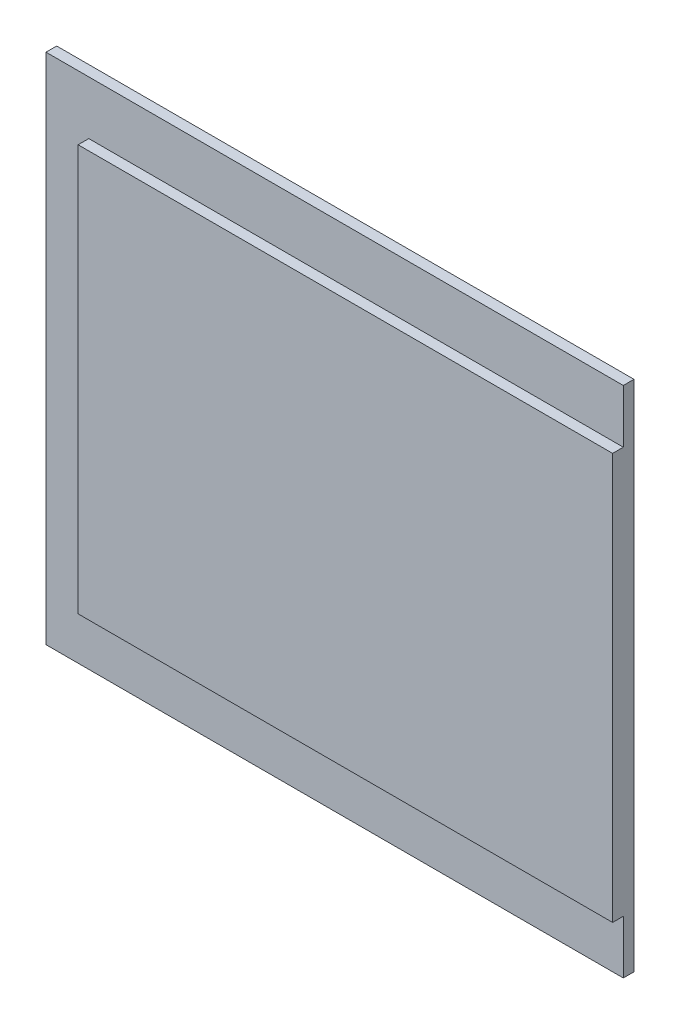
ISO-10303-21;
HEADER;
FILE_DESCRIPTION(('STEP AP214'),'2;1');
FILE_NAME('part.step','',(''),(''),'','','');
FILE_SCHEMA(('AUTOMOTIVE_DESIGN { 1 0 10303 214 1 1 1 1 }'));
ENDSEC;
DATA;
#1=APPLICATION_CONTEXT('core data for automotive mechanical design processes');
#2=APPLICATION_PROTOCOL_DEFINITION('international standard','automotive_design',2000,#1);
#3=PRODUCT_CONTEXT('',#1,'mechanical');
#4=PRODUCT('Part','Part','',(#3));
#5=PRODUCT_RELATED_PRODUCT_CATEGORY('part','',(#4));
#6=PRODUCT_DEFINITION_FORMATION('','',#4);
#7=PRODUCT_DEFINITION_CONTEXT('part definition',#1,'design');
#8=PRODUCT_DEFINITION('design','',#6,#7);
#9=PRODUCT_DEFINITION_SHAPE('','',#8);
#10=(LENGTH_UNIT() NAMED_UNIT(*) SI_UNIT(.MILLI.,.METRE.));
#11=(NAMED_UNIT(*) PLANE_ANGLE_UNIT() SI_UNIT($,.RADIAN.));
#12=(NAMED_UNIT(*) SI_UNIT($,.STERADIAN.) SOLID_ANGLE_UNIT());
#13=UNCERTAINTY_MEASURE_WITH_UNIT(LENGTH_MEASURE(1.E-05),#10,'distance_accuracy_value','');
#14=(GEOMETRIC_REPRESENTATION_CONTEXT(3) GLOBAL_UNCERTAINTY_ASSIGNED_CONTEXT((#13)) GLOBAL_UNIT_ASSIGNED_CONTEXT((#10,
#11,#12)) REPRESENTATION_CONTEXT('',''));
#15=CARTESIAN_POINT('',(0.,0.,0.));
#16=DIRECTION('',(0.,0.,1.));
#17=DIRECTION('',(1.,0.,0.));
#18=AXIS2_PLACEMENT_3D('',#15,#16,#17);
#19=CARTESIAN_POINT('',(0.,0.,1.));
#20=DIRECTION('',(0.,0.,-1.));
#21=DIRECTION('',(-1.,0.,0.));
#22=AXIS2_PLACEMENT_3D('',#19,#20,#21);
#23=PLANE('',#22);
#24=DIRECTION('',(1.,0.,0.));
#25=VECTOR('',#24,1.);
#26=CARTESIAN_POINT('',(-23.,-19.,1.));
#27=LINE('',#26,#25);
#28=CARTESIAN_POINT('',(-23.,-19.,1.));
#29=VERTEX_POINT('',#28);
#30=CARTESIAN_POINT('',(27.,-19.,1.));
#31=VERTEX_POINT('',#30);
#32=EDGE_CURVE('E50',#29,#31,#27,.T.);
#33=ORIENTED_EDGE('',*,*,#32,.F.);
#34=DIRECTION('',(0.,-1.,0.));
#35=VECTOR('',#34,1.);
#36=CARTESIAN_POINT('',(-23.,-19.,1.));
#37=LINE('',#36,#35);
#38=CARTESIAN_POINT('',(-23.,19.,1.));
#39=VERTEX_POINT('',#38);
#40=EDGE_CURVE('E171',#39,#29,#37,.T.);
#41=ORIENTED_EDGE('',*,*,#40,.F.);
#42=DIRECTION('',(-1.,0.,0.));
#43=VECTOR('',#42,1.);
#44=CARTESIAN_POINT('',(-23.,19.,1.));
#45=LINE('',#44,#43);
#46=CARTESIAN_POINT('',(27.,19.,1.));
#47=VERTEX_POINT('',#46);
#48=EDGE_CURVE('E56',#47,#39,#45,.T.);
#49=ORIENTED_EDGE('',*,*,#48,.F.);
#50=DIRECTION('',(0.,1.,0.));
#51=VECTOR('',#50,1.);
#52=CARTESIAN_POINT('',(27.,-24.,1.));
#53=LINE('',#52,#51);
#54=CARTESIAN_POINT('',(27.,24.,1.));
#55=VERTEX_POINT('',#54);
#56=EDGE_CURVE('E121',#47,#55,#53,.T.);
#57=ORIENTED_EDGE('',*,*,#56,.T.);
#58=DIRECTION('',(-1.,0.,0.));
#59=VECTOR('',#58,1.);
#60=CARTESIAN_POINT('',(-27.,24.,1.));
#61=LINE('',#60,#59);
#62=CARTESIAN_POINT('',(-27.,24.,1.));
#63=VERTEX_POINT('',#62);
#64=EDGE_CURVE('E132',#55,#63,#61,.T.);
#65=ORIENTED_EDGE('',*,*,#64,.T.);
#66=DIRECTION('',(0.,-1.,0.));
#67=VECTOR('',#66,1.);
#68=CARTESIAN_POINT('',(-27.,-24.,1.));
#69=LINE('',#68,#67);
#70=CARTESIAN_POINT('',(-27.,-24.,1.));
#71=VERTEX_POINT('',#70);
#72=EDGE_CURVE('E134',#63,#71,#69,.T.);
#73=ORIENTED_EDGE('',*,*,#72,.T.);
#74=DIRECTION('',(1.,0.,0.));
#75=VECTOR('',#74,1.);
#76=CARTESIAN_POINT('',(-27.,-24.,1.));
#77=LINE('',#76,#75);
#78=CARTESIAN_POINT('',(27.,-24.,1.));
#79=VERTEX_POINT('',#78);
#80=EDGE_CURVE('E136',#71,#79,#77,.T.);
#81=ORIENTED_EDGE('',*,*,#80,.T.);
#82=EDGE_CURVE('E130',#79,#31,#53,.T.);
#83=ORIENTED_EDGE('',*,*,#82,.T.);
#84=EDGE_LOOP('',(#33,#41,#49,#57,#65,#73,#81,#83));
#85=FACE_BOUND('',#84,.T.);
#86=ADVANCED_FACE('F35',(#85),#23,.F.);
#87=CARTESIAN_POINT('',(27.,-24.,1.));
#88=DIRECTION('',(-1.,0.,0.));
#89=DIRECTION('',(0.,0.,1.));
#90=AXIS2_PLACEMENT_3D('',#87,#88,#89);
#91=PLANE('',#90);
#92=DIRECTION('',(0.,1.,0.));
#93=VECTOR('',#92,1.);
#94=CARTESIAN_POINT('',(27.,-24.,0.));
#95=LINE('',#94,#93);
#96=CARTESIAN_POINT('',(27.,-24.,0.));
#97=VERTEX_POINT('',#96);
#98=CARTESIAN_POINT('',(27.,24.,0.));
#99=VERTEX_POINT('',#98);
#100=EDGE_CURVE('E122',#97,#99,#95,.T.);
#101=ORIENTED_EDGE('',*,*,#100,.T.);
#102=DIRECTION('',(0.,0.,-1.));
#103=VECTOR('',#102,1.);
#104=CARTESIAN_POINT('',(27.,24.,1.));
#105=LINE('',#104,#103);
#106=EDGE_CURVE('E11',#55,#99,#105,.T.);
#107=ORIENTED_EDGE('',*,*,#106,.F.);
#108=ORIENTED_EDGE('',*,*,#56,.F.);
#109=DIRECTION('',(0.,0.,-1.));
#110=VECTOR('',#109,1.);
#111=CARTESIAN_POINT('',(27.,19.,2.));
#112=LINE('',#111,#110);
#113=CARTESIAN_POINT('',(27.,19.,2.));
#114=VERTEX_POINT('',#113);
#115=EDGE_CURVE('E103',#114,#47,#112,.T.);
#116=ORIENTED_EDGE('',*,*,#115,.F.);
#117=DIRECTION('',(0.,1.,0.));
#118=VECTOR('',#117,1.);
#119=CARTESIAN_POINT('',(27.,-19.,2.));
#120=LINE('',#119,#118);
#121=CARTESIAN_POINT('',(27.,-19.,2.));
#122=VERTEX_POINT('',#121);
#123=EDGE_CURVE('E109',#122,#114,#120,.T.);
#124=ORIENTED_EDGE('',*,*,#123,.F.);
#125=DIRECTION('',(0.,0.,-1.));
#126=VECTOR('',#125,1.);
#127=CARTESIAN_POINT('',(27.,-19.,2.));
#128=LINE('',#127,#126);
#129=EDGE_CURVE('E166',#122,#31,#128,.T.);
#130=ORIENTED_EDGE('',*,*,#129,.T.);
#131=ORIENTED_EDGE('',*,*,#82,.F.);
#132=DIRECTION('',(0.,0.,-1.));
#133=VECTOR('',#132,1.);
#134=CARTESIAN_POINT('',(27.,-24.,1.));
#135=LINE('',#134,#133);
#136=EDGE_CURVE('E137',#79,#97,#135,.T.);
#137=ORIENTED_EDGE('',*,*,#136,.T.);
#138=EDGE_LOOP('',(#101,#107,#108,#116,#124,#130,#131,#137));
#139=FACE_BOUND('',#138,.T.);
#140=ADVANCED_FACE('F37',(#139),#91,.F.);
#141=CARTESIAN_POINT('',(-27.,24.,1.));
#142=DIRECTION('',(0.,-1.,0.));
#143=DIRECTION('',(0.,0.,-1.));
#144=AXIS2_PLACEMENT_3D('',#141,#142,#143);
#145=PLANE('',#144);
#146=DIRECTION('',(-1.,0.,0.));
#147=VECTOR('',#146,1.);
#148=CARTESIAN_POINT('',(-27.,24.,0.));
#149=LINE('',#148,#147);
#150=CARTESIAN_POINT('',(-27.,24.,0.));
#151=VERTEX_POINT('',#150);
#152=EDGE_CURVE('E124',#99,#151,#149,.T.);
#153=ORIENTED_EDGE('',*,*,#152,.T.);
#154=DIRECTION('',(0.,0.,-1.));
#155=VECTOR('',#154,1.);
#156=CARTESIAN_POINT('',(-27.,24.,1.));
#157=LINE('',#156,#155);
#158=EDGE_CURVE('E43',#63,#151,#157,.T.);
#159=ORIENTED_EDGE('',*,*,#158,.F.);
#160=ORIENTED_EDGE('',*,*,#64,.F.);
#161=ORIENTED_EDGE('',*,*,#106,.T.);
#162=EDGE_LOOP('',(#153,#159,#160,#161));
#163=FACE_BOUND('',#162,.T.);
#164=ADVANCED_FACE('F193',(#163),#145,.F.);
#165=CARTESIAN_POINT('',(-27.,-24.,1.));
#166=DIRECTION('',(1.,0.,0.));
#167=DIRECTION('',(0.,0.,-1.));
#168=AXIS2_PLACEMENT_3D('',#165,#166,#167);
#169=PLANE('',#168);
#170=DIRECTION('',(0.,-1.,0.));
#171=VECTOR('',#170,1.);
#172=CARTESIAN_POINT('',(-27.,-24.,0.));
#173=LINE('',#172,#171);
#174=CARTESIAN_POINT('',(-27.,-24.,0.));
#175=VERTEX_POINT('',#174);
#176=EDGE_CURVE('E140',#151,#175,#173,.T.);
#177=ORIENTED_EDGE('',*,*,#176,.T.);
#178=DIRECTION('',(0.,0.,-1.));
#179=VECTOR('',#178,1.);
#180=CARTESIAN_POINT('',(-27.,-24.,1.));
#181=LINE('',#180,#179);
#182=EDGE_CURVE('E146',#71,#175,#181,.T.);
#183=ORIENTED_EDGE('',*,*,#182,.F.);
#184=ORIENTED_EDGE('',*,*,#72,.F.);
#185=ORIENTED_EDGE('',*,*,#158,.T.);
#186=EDGE_LOOP('',(#177,#183,#184,#185));
#187=FACE_BOUND('',#186,.T.);
#188=ADVANCED_FACE('F153',(#187),#169,.F.);
#189=CARTESIAN_POINT('',(-27.,-24.,1.));
#190=DIRECTION('',(0.,1.,0.));
#191=DIRECTION('',(0.,0.,1.));
#192=AXIS2_PLACEMENT_3D('',#189,#190,#191);
#193=PLANE('',#192);
#194=DIRECTION('',(1.,0.,0.));
#195=VECTOR('',#194,1.);
#196=CARTESIAN_POINT('',(-27.,-24.,0.));
#197=LINE('',#196,#195);
#198=EDGE_CURVE('E142',#175,#97,#197,.T.);
#199=ORIENTED_EDGE('',*,*,#198,.T.);
#200=ORIENTED_EDGE('',*,*,#136,.F.);
#201=ORIENTED_EDGE('',*,*,#80,.F.);
#202=ORIENTED_EDGE('',*,*,#182,.T.);
#203=EDGE_LOOP('',(#199,#200,#201,#202));
#204=FACE_BOUND('',#203,.T.);
#205=ADVANCED_FACE('F163',(#204),#193,.F.);
#206=CARTESIAN_POINT('',(0.,0.,0.));
#207=DIRECTION('',(0.,0.,-1.));
#208=DIRECTION('',(-1.,0.,0.));
#209=AXIS2_PLACEMENT_3D('',#206,#207,#208);
#210=PLANE('',#209);
#211=ORIENTED_EDGE('',*,*,#100,.F.);
#212=ORIENTED_EDGE('',*,*,#198,.F.);
#213=ORIENTED_EDGE('',*,*,#176,.F.);
#214=ORIENTED_EDGE('',*,*,#152,.F.);
#215=EDGE_LOOP('',(#211,#212,#213,#214));
#216=FACE_BOUND('',#215,.T.);
#217=ADVANCED_FACE('F160',(#216),#210,.T.);
#218=CARTESIAN_POINT('',(-23.,19.,2.));
#219=DIRECTION('',(0.,-1.,0.));
#220=DIRECTION('',(1.,0.,0.));
#221=AXIS2_PLACEMENT_3D('',#218,#219,#220);
#222=PLANE('',#221);
#223=ORIENTED_EDGE('',*,*,#48,.T.);
#224=DIRECTION('',(0.,0.,-1.));
#225=VECTOR('',#224,1.);
#226=CARTESIAN_POINT('',(-23.,19.,2.));
#227=LINE('',#226,#225);
#228=CARTESIAN_POINT('',(-23.,19.,2.));
#229=VERTEX_POINT('',#228);
#230=EDGE_CURVE('E105',#229,#39,#227,.T.);
#231=ORIENTED_EDGE('',*,*,#230,.F.);
#232=DIRECTION('',(-1.,0.,0.));
#233=VECTOR('',#232,1.);
#234=CARTESIAN_POINT('',(-23.,19.,2.));
#235=LINE('',#234,#233);
#236=EDGE_CURVE('E99',#114,#229,#235,.T.);
#237=ORIENTED_EDGE('',*,*,#236,.F.);
#238=ORIENTED_EDGE('',*,*,#115,.T.);
#239=EDGE_LOOP('',(#223,#231,#237,#238));
#240=FACE_BOUND('',#239,.T.);
#241=ADVANCED_FACE('F101',(#240),#222,.F.);
#242=CARTESIAN_POINT('',(-23.,-19.,2.));
#243=DIRECTION('',(1.,0.,0.));
#244=DIRECTION('',(0.,0.,-1.));
#245=AXIS2_PLACEMENT_3D('',#242,#243,#244);
#246=PLANE('',#245);
#247=ORIENTED_EDGE('',*,*,#40,.T.);
#248=DIRECTION('',(0.,0.,-1.));
#249=VECTOR('',#248,1.);
#250=CARTESIAN_POINT('',(-23.,-19.,2.));
#251=LINE('',#250,#249);
#252=CARTESIAN_POINT('',(-23.,-19.,2.));
#253=VERTEX_POINT('',#252);
#254=EDGE_CURVE('E126',#253,#29,#251,.T.);
#255=ORIENTED_EDGE('',*,*,#254,.F.);
#256=DIRECTION('',(0.,-1.,0.));
#257=VECTOR('',#256,1.);
#258=CARTESIAN_POINT('',(-23.,-19.,2.));
#259=LINE('',#258,#257);
#260=EDGE_CURVE('E108',#229,#253,#259,.T.);
#261=ORIENTED_EDGE('',*,*,#260,.F.);
#262=ORIENTED_EDGE('',*,*,#230,.T.);
#263=EDGE_LOOP('',(#247,#255,#261,#262));
#264=FACE_BOUND('',#263,.T.);
#265=ADVANCED_FACE('F179',(#264),#246,.F.);
#266=CARTESIAN_POINT('',(-23.,-19.,2.));
#267=DIRECTION('',(0.,1.,0.));
#268=DIRECTION('',(0.,0.,1.));
#269=AXIS2_PLACEMENT_3D('',#266,#267,#268);
#270=PLANE('',#269);
#271=ORIENTED_EDGE('',*,*,#32,.T.);
#272=ORIENTED_EDGE('',*,*,#129,.F.);
#273=DIRECTION('',(1.,0.,0.));
#274=VECTOR('',#273,1.);
#275=CARTESIAN_POINT('',(-23.,-19.,2.));
#276=LINE('',#275,#274);
#277=EDGE_CURVE('E114',#253,#122,#276,.T.);
#278=ORIENTED_EDGE('',*,*,#277,.F.);
#279=ORIENTED_EDGE('',*,*,#254,.T.);
#280=EDGE_LOOP('',(#271,#272,#278,#279));
#281=FACE_BOUND('',#280,.T.);
#282=ADVANCED_FACE('F169',(#281),#270,.F.);
#283=CARTESIAN_POINT('',(0.,0.,2.));
#284=DIRECTION('',(0.,0.,-1.));
#285=DIRECTION('',(-1.,0.,0.));
#286=AXIS2_PLACEMENT_3D('',#283,#284,#285);
#287=PLANE('',#286);
#288=ORIENTED_EDGE('',*,*,#123,.T.);
#289=ORIENTED_EDGE('',*,*,#236,.T.);
#290=ORIENTED_EDGE('',*,*,#260,.T.);
#291=ORIENTED_EDGE('',*,*,#277,.T.);
#292=EDGE_LOOP('',(#288,#289,#290,#291));
#293=FACE_BOUND('',#292,.T.);
#294=ADVANCED_FACE('F112',(#293),#287,.F.);
#295=CLOSED_SHELL('',(#86,#140,#164,#188,#205,#217,#241,#265,#282,#294));
#296=MANIFOLD_SOLID_BREP('B2',#295);
#297=ADVANCED_BREP_SHAPE_REPRESENTATION('',(#18,#296),#14);
#298=SHAPE_DEFINITION_REPRESENTATION(#9,#297);
ENDSEC;
END-ISO-10303-21;
